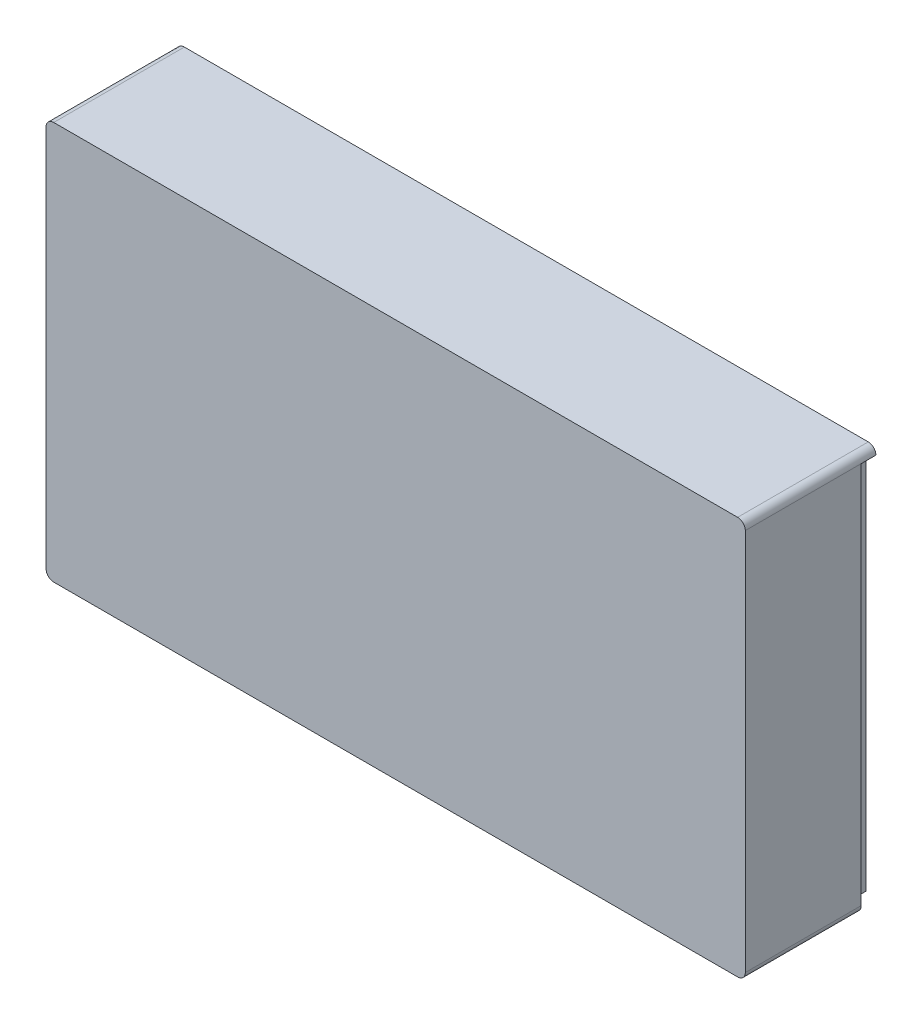
ISO-10303-21;
HEADER;
FILE_DESCRIPTION(('STEP AP214'),'2;1');
FILE_NAME('part.step','',(''),(''),'','','');
FILE_SCHEMA(('AUTOMOTIVE_DESIGN { 1 0 10303 214 1 1 1 1 }'));
ENDSEC;
DATA;
#1=APPLICATION_CONTEXT('core data for automotive mechanical design processes');
#2=APPLICATION_PROTOCOL_DEFINITION('international standard','automotive_design',2000,#1);
#3=PRODUCT_CONTEXT('',#1,'mechanical');
#4=PRODUCT('Part','Part','',(#3));
#5=PRODUCT_RELATED_PRODUCT_CATEGORY('part','',(#4));
#6=PRODUCT_DEFINITION_FORMATION('','',#4);
#7=PRODUCT_DEFINITION_CONTEXT('part definition',#1,'design');
#8=PRODUCT_DEFINITION('design','',#6,#7);
#9=PRODUCT_DEFINITION_SHAPE('','',#8);
#10=(LENGTH_UNIT() NAMED_UNIT(*) SI_UNIT(.MILLI.,.METRE.));
#11=(NAMED_UNIT(*) PLANE_ANGLE_UNIT() SI_UNIT($,.RADIAN.));
#12=(NAMED_UNIT(*) SI_UNIT($,.STERADIAN.) SOLID_ANGLE_UNIT());
#13=UNCERTAINTY_MEASURE_WITH_UNIT(LENGTH_MEASURE(1.E-05),#10,'distance_accuracy_value','');
#14=(GEOMETRIC_REPRESENTATION_CONTEXT(3) GLOBAL_UNCERTAINTY_ASSIGNED_CONTEXT((#13)) GLOBAL_UNIT_ASSIGNED_CONTEXT((#10,
#11,#12)) REPRESENTATION_CONTEXT('',''));
#15=CARTESIAN_POINT('',(0.,0.,0.));
#16=DIRECTION('',(0.,0.,1.));
#17=DIRECTION('',(1.,0.,0.));
#18=AXIS2_PLACEMENT_3D('',#15,#16,#17);
#19=CARTESIAN_POINT('',(0.,0.,0.));
#20=DIRECTION('',(0.,0.,1.));
#21=DIRECTION('',(1.,0.,0.));
#22=AXIS2_PLACEMENT_3D('',#19,#20,#21);
#23=PLANE('',#22);
#24=DIRECTION('',(1.,0.,0.));
#25=VECTOR('',#24,1.);
#26=CARTESIAN_POINT('',(145.,-79.3,0.));
#27=LINE('',#26,#25);
#28=CARTESIAN_POINT('',(-140.9,-79.3,0.));
#29=VERTEX_POINT('',#28);
#30=CARTESIAN_POINT('',(-133.825,-79.3,0.));
#31=VERTEX_POINT('',#30);
#32=EDGE_CURVE('E460',#29,#31,#27,.T.);
#33=ORIENTED_EDGE('',*,*,#32,.F.);
#34=DIRECTION('',(0.,-1.,0.));
#35=VECTOR('',#34,1.);
#36=CARTESIAN_POINT('',(-140.9,89.5150197238467,0.));
#37=LINE('',#36,#35);
#38=CARTESIAN_POINT('',(-140.9,79.375,0.));
#39=VERTEX_POINT('',#38);
#40=EDGE_CURVE('E411',#39,#29,#37,.T.);
#41=ORIENTED_EDGE('',*,*,#40,.F.);
#42=DIRECTION('',(1.,0.,0.));
#43=VECTOR('',#42,1.);
#44=CARTESIAN_POINT('',(-140.9,79.375,0.));
#45=LINE('',#44,#43);
#46=CARTESIAN_POINT('',(-145.,79.375,0.));
#47=VERTEX_POINT('',#46);
#48=EDGE_CURVE('E432',#47,#39,#45,.T.);
#49=ORIENTED_EDGE('',*,*,#48,.F.);
#50=CARTESIAN_POINT('',(-141.825,79.375,0.));
#51=DIRECTION('',(0.,0.,1.));
#52=DIRECTION('',(1.,0.,0.));
#53=AXIS2_PLACEMENT_3D('',#50,#51,#52);
#54=CIRCLE('',#53,3.175);
#55=CARTESIAN_POINT('',(-141.825,82.55,0.));
#56=VERTEX_POINT('',#55);
#57=EDGE_CURVE('E64',#47,#56,#54,.F.);
#58=ORIENTED_EDGE('',*,*,#57,.T.);
#59=DIRECTION('',(-1.,0.,0.));
#60=VECTOR('',#59,1.);
#61=CARTESIAN_POINT('',(-145.,82.55,0.));
#62=LINE('',#61,#60);
#63=CARTESIAN_POINT('',(141.825,82.55,0.));
#64=VERTEX_POINT('',#63);
#65=EDGE_CURVE('E294',#64,#56,#62,.T.);
#66=ORIENTED_EDGE('',*,*,#65,.F.);
#67=CARTESIAN_POINT('',(141.825,79.375,0.));
#68=DIRECTION('',(0.,0.,1.));
#69=DIRECTION('',(1.,0.,0.));
#70=AXIS2_PLACEMENT_3D('',#67,#68,#69);
#71=CIRCLE('',#70,3.175);
#72=CARTESIAN_POINT('',(145.,79.375,0.));
#73=VERTEX_POINT('',#72);
#74=EDGE_CURVE('E324',#64,#73,#71,.F.);
#75=ORIENTED_EDGE('',*,*,#74,.T.);
#76=DIRECTION('',(-1.,0.,0.));
#77=VECTOR('',#76,1.);
#78=CARTESIAN_POINT('',(140.9,79.375,0.));
#79=LINE('',#78,#77);
#80=CARTESIAN_POINT('',(140.9,79.375,0.));
#81=VERTEX_POINT('',#80);
#82=EDGE_CURVE('E259',#73,#81,#79,.T.);
#83=ORIENTED_EDGE('',*,*,#82,.T.);
#84=DIRECTION('',(0.,-1.,0.));
#85=VECTOR('',#84,1.);
#86=CARTESIAN_POINT('',(140.9,89.5150197238467,0.));
#87=LINE('',#86,#85);
#88=CARTESIAN_POINT('',(140.9,-79.3,0.));
#89=VERTEX_POINT('',#88);
#90=EDGE_CURVE('E370',#81,#89,#87,.T.);
#91=ORIENTED_EDGE('',*,*,#90,.T.);
#92=CARTESIAN_POINT('',(133.825,-79.3,0.));
#93=VERTEX_POINT('',#92);
#94=EDGE_CURVE('E240',#93,#89,#27,.T.);
#95=ORIENTED_EDGE('',*,*,#94,.F.);
#96=DIRECTION('',(0.,1.,0.));
#97=VECTOR('',#96,1.);
#98=CARTESIAN_POINT('',(133.825,79.375,0.));
#99=LINE('',#98,#97);
#100=CARTESIAN_POINT('',(133.825,79.375,0.));
#101=VERTEX_POINT('',#100);
#102=EDGE_CURVE('E280',#93,#101,#99,.T.);
#103=ORIENTED_EDGE('',*,*,#102,.T.);
#104=DIRECTION('',(-1.,0.,0.));
#105=VECTOR('',#104,1.);
#106=CARTESIAN_POINT('',(-133.825,79.375,0.));
#107=LINE('',#106,#105);
#108=CARTESIAN_POINT('',(-133.825,79.375,0.));
#109=VERTEX_POINT('',#108);
#110=EDGE_CURVE('E275',#101,#109,#107,.T.);
#111=ORIENTED_EDGE('',*,*,#110,.T.);
#112=DIRECTION('',(0.,-1.,0.));
#113=VECTOR('',#112,1.);
#114=CARTESIAN_POINT('',(-133.825,-79.375,0.));
#115=LINE('',#114,#113);
#116=EDGE_CURVE('E271',#109,#31,#115,.T.);
#117=ORIENTED_EDGE('',*,*,#116,.T.);
#118=EDGE_LOOP('',(#33,#41,#49,#58,#66,#75,#83,#91,#95,#103,#111,#117));
#119=FACE_BOUND('',#118,.T.);
#120=ADVANCED_FACE('F41',(#119),#23,.F.);
#121=CARTESIAN_POINT('',(140.9,89.5150197238467,2.9));
#122=DIRECTION('',(-1.,0.,0.));
#123=DIRECTION('',(0.,-1.,0.));
#124=AXIS2_PLACEMENT_3D('',#121,#122,#123);
#125=PLANE('',#124);
#126=DIRECTION('',(0.,0.,1.));
#127=VECTOR('',#126,1.);
#128=CARTESIAN_POINT('',(140.9,-79.3,2.9));
#129=LINE('',#128,#127);
#130=CARTESIAN_POINT('',(140.9,-79.3,2.9));
#131=VERTEX_POINT('',#130);
#132=EDGE_CURVE('E377',#89,#131,#129,.T.);
#133=ORIENTED_EDGE('',*,*,#132,.F.);
#134=ORIENTED_EDGE('',*,*,#90,.F.);
#135=DIRECTION('',(0.,0.,1.));
#136=VECTOR('',#135,1.);
#137=CARTESIAN_POINT('',(140.9,79.375,2.9));
#138=LINE('',#137,#136);
#139=CARTESIAN_POINT('',(140.9,79.375,2.9));
#140=VERTEX_POINT('',#139);
#141=EDGE_CURVE('E343',#81,#140,#138,.T.);
#142=ORIENTED_EDGE('',*,*,#141,.T.);
#143=DIRECTION('',(0.,-1.,0.));
#144=VECTOR('',#143,1.);
#145=CARTESIAN_POINT('',(140.9,89.5150197238467,2.9));
#146=LINE('',#145,#144);
#147=EDGE_CURVE('E249',#140,#131,#146,.T.);
#148=ORIENTED_EDGE('',*,*,#147,.T.);
#149=EDGE_LOOP('',(#133,#134,#142,#148));
#150=FACE_BOUND('',#149,.T.);
#151=ADVANCED_FACE('F376',(#150),#125,.F.);
#152=CARTESIAN_POINT('',(140.9,89.5150197238467,2.9));
#153=DIRECTION('',(0.,0.,-1.));
#154=DIRECTION('',(-1.,0.,0.));
#155=AXIS2_PLACEMENT_3D('',#152,#153,#154);
#156=PLANE('',#155);
#157=DIRECTION('',(-1.,0.,0.));
#158=VECTOR('',#157,1.);
#159=CARTESIAN_POINT('',(140.9,-79.3,2.9));
#160=LINE('',#159,#158);
#161=CARTESIAN_POINT('',(136.9,-79.3,2.90000000000003));
#162=VERTEX_POINT('',#161);
#163=EDGE_CURVE('E227',#131,#162,#160,.T.);
#164=ORIENTED_EDGE('',*,*,#163,.F.);
#165=ORIENTED_EDGE('',*,*,#147,.F.);
#166=DIRECTION('',(-1.,0.,0.));
#167=VECTOR('',#166,1.);
#168=CARTESIAN_POINT('',(140.9,79.375,2.9));
#169=LINE('',#168,#167);
#170=CARTESIAN_POINT('',(136.9,79.375,2.90000000000003));
#171=VERTEX_POINT('',#170);
#172=EDGE_CURVE('E380',#140,#171,#169,.T.);
#173=ORIENTED_EDGE('',*,*,#172,.T.);
#174=DIRECTION('',(0.,-1.,0.));
#175=VECTOR('',#174,1.);
#176=CARTESIAN_POINT('',(136.9,89.5150197238467,2.90000000000003));
#177=LINE('',#176,#175);
#178=EDGE_CURVE('E246',#171,#162,#177,.T.);
#179=ORIENTED_EDGE('',*,*,#178,.T.);
#180=EDGE_LOOP('',(#164,#165,#173,#179));
#181=FACE_BOUND('',#180,.T.);
#182=ADVANCED_FACE('F379',(#181),#156,.F.);
#183=CARTESIAN_POINT('',(136.9,89.5150197238467,2.90000000000003));
#184=DIRECTION('',(-1.,0.,0.));
#185=DIRECTION('',(0.,-1.,0.));
#186=AXIS2_PLACEMENT_3D('',#183,#184,#185);
#187=PLANE('',#186);
#188=DIRECTION('',(0.,0.,1.));
#189=VECTOR('',#188,1.);
#190=CARTESIAN_POINT('',(136.9,-79.3,2.90000000000003));
#191=LINE('',#190,#189);
#192=CARTESIAN_POINT('',(136.9,-79.3,6.1));
#193=VERTEX_POINT('',#192);
#194=EDGE_CURVE('E221',#162,#193,#191,.T.);
#195=ORIENTED_EDGE('',*,*,#194,.F.);
#196=ORIENTED_EDGE('',*,*,#178,.F.);
#197=DIRECTION('',(0.,0.,1.));
#198=VECTOR('',#197,1.);
#199=CARTESIAN_POINT('',(136.9,79.375,2.90000000000003));
#200=LINE('',#199,#198);
#201=CARTESIAN_POINT('',(136.9,79.375,6.1));
#202=VERTEX_POINT('',#201);
#203=EDGE_CURVE('E244',#171,#202,#200,.T.);
#204=ORIENTED_EDGE('',*,*,#203,.T.);
#205=DIRECTION('',(0.,-1.,0.));
#206=VECTOR('',#205,1.);
#207=CARTESIAN_POINT('',(136.9,89.5150197238467,6.1));
#208=LINE('',#207,#206);
#209=EDGE_CURVE('E237',#202,#193,#208,.T.);
#210=ORIENTED_EDGE('',*,*,#209,.T.);
#211=EDGE_LOOP('',(#195,#196,#204,#210));
#212=FACE_BOUND('',#211,.T.);
#213=ADVANCED_FACE('F242',(#212),#187,.F.);
#214=CARTESIAN_POINT('',(-140.9,89.5150197238467,2.9));
#215=DIRECTION('',(-1.,0.,0.));
#216=DIRECTION('',(0.,-1.,0.));
#217=AXIS2_PLACEMENT_3D('',#214,#215,#216);
#218=PLANE('',#217);
#219=ORIENTED_EDGE('',*,*,#40,.T.);
#220=DIRECTION('',(0.,0.,1.));
#221=VECTOR('',#220,1.);
#222=CARTESIAN_POINT('',(-140.9,-79.3,2.9));
#223=LINE('',#222,#221);
#224=CARTESIAN_POINT('',(-140.9,-79.3,2.9));
#225=VERTEX_POINT('',#224);
#226=EDGE_CURVE('E232',#29,#225,#223,.T.);
#227=ORIENTED_EDGE('',*,*,#226,.T.);
#228=DIRECTION('',(0.,-1.,0.));
#229=VECTOR('',#228,1.);
#230=CARTESIAN_POINT('',(-140.9,89.5150197238467,2.9));
#231=LINE('',#230,#229);
#232=CARTESIAN_POINT('',(-140.9,79.375,2.9));
#233=VERTEX_POINT('',#232);
#234=EDGE_CURVE('E448',#233,#225,#231,.T.);
#235=ORIENTED_EDGE('',*,*,#234,.F.);
#236=DIRECTION('',(0.,0.,1.));
#237=VECTOR('',#236,1.);
#238=CARTESIAN_POINT('',(-140.9,79.375,2.9));
#239=LINE('',#238,#237);
#240=EDGE_CURVE('E428',#39,#233,#239,.T.);
#241=ORIENTED_EDGE('',*,*,#240,.F.);
#242=EDGE_LOOP('',(#219,#227,#235,#241));
#243=FACE_BOUND('',#242,.T.);
#244=ADVANCED_FACE('F463',(#243),#218,.T.);
#245=CARTESIAN_POINT('',(-140.9,89.5150197238467,2.9));
#246=DIRECTION('',(0.,0.,1.));
#247=DIRECTION('',(1.,0.,0.));
#248=AXIS2_PLACEMENT_3D('',#245,#246,#247);
#249=PLANE('',#248);
#250=ORIENTED_EDGE('',*,*,#234,.T.);
#251=DIRECTION('',(1.,0.,0.));
#252=VECTOR('',#251,1.);
#253=CARTESIAN_POINT('',(-140.9,-79.3,2.9));
#254=LINE('',#253,#252);
#255=CARTESIAN_POINT('',(-136.9,-79.3,2.90000000000003));
#256=VERTEX_POINT('',#255);
#257=EDGE_CURVE('E469',#225,#256,#254,.T.);
#258=ORIENTED_EDGE('',*,*,#257,.T.);
#259=DIRECTION('',(0.,-1.,0.));
#260=VECTOR('',#259,1.);
#261=CARTESIAN_POINT('',(-136.9,89.5150197238467,2.90000000000003));
#262=LINE('',#261,#260);
#263=CARTESIAN_POINT('',(-136.9,79.375,2.90000000000003));
#264=VERTEX_POINT('',#263);
#265=EDGE_CURVE('E445',#264,#256,#262,.T.);
#266=ORIENTED_EDGE('',*,*,#265,.F.);
#267=DIRECTION('',(1.,0.,0.));
#268=VECTOR('',#267,1.);
#269=CARTESIAN_POINT('',(-140.9,79.375,2.9));
#270=LINE('',#269,#268);
#271=EDGE_CURVE('E431',#233,#264,#270,.T.);
#272=ORIENTED_EDGE('',*,*,#271,.F.);
#273=EDGE_LOOP('',(#250,#258,#266,#272));
#274=FACE_BOUND('',#273,.T.);
#275=ADVANCED_FACE('F467',(#274),#249,.T.);
#276=CARTESIAN_POINT('',(-136.9,89.5150197238467,2.90000000000003));
#277=DIRECTION('',(-1.,0.,0.));
#278=DIRECTION('',(0.,-1.,0.));
#279=AXIS2_PLACEMENT_3D('',#276,#277,#278);
#280=PLANE('',#279);
#281=ORIENTED_EDGE('',*,*,#265,.T.);
#282=DIRECTION('',(0.,0.,1.));
#283=VECTOR('',#282,1.);
#284=CARTESIAN_POINT('',(-136.9,-79.3,2.90000000000003));
#285=LINE('',#284,#283);
#286=CARTESIAN_POINT('',(-136.9,-79.3,6.1));
#287=VERTEX_POINT('',#286);
#288=EDGE_CURVE('E473',#256,#287,#285,.T.);
#289=ORIENTED_EDGE('',*,*,#288,.T.);
#290=DIRECTION('',(0.,-1.,0.));
#291=VECTOR('',#290,1.);
#292=CARTESIAN_POINT('',(-136.9,89.5150197238467,6.1));
#293=LINE('',#292,#291);
#294=CARTESIAN_POINT('',(-136.9,79.375,6.1));
#295=VERTEX_POINT('',#294);
#296=EDGE_CURVE('E442',#295,#287,#293,.T.);
#297=ORIENTED_EDGE('',*,*,#296,.F.);
#298=DIRECTION('',(0.,0.,1.));
#299=VECTOR('',#298,1.);
#300=CARTESIAN_POINT('',(-136.9,79.375,2.90000000000003));
#301=LINE('',#300,#299);
#302=EDGE_CURVE('E435',#264,#295,#301,.T.);
#303=ORIENTED_EDGE('',*,*,#302,.F.);
#304=EDGE_LOOP('',(#281,#289,#297,#303));
#305=FACE_BOUND('',#304,.T.);
#306=ADVANCED_FACE('F472',(#305),#280,.T.);
#307=CARTESIAN_POINT('',(133.825,79.375,51.));
#308=DIRECTION('',(-1.,0.,0.));
#309=DIRECTION('',(0.,0.,1.));
#310=AXIS2_PLACEMENT_3D('',#307,#308,#309);
#311=PLANE('',#310);
#312=DIRECTION('',(0.,1.,0.));
#313=VECTOR('',#312,1.);
#314=CARTESIAN_POINT('',(133.825,79.375,6.1));
#315=LINE('',#314,#313);
#316=CARTESIAN_POINT('',(133.825,-79.375,6.1));
#317=VERTEX_POINT('',#316);
#318=CARTESIAN_POINT('',(133.825,-79.3,6.1));
#319=VERTEX_POINT('',#318);
#320=EDGE_CURVE('E239',#317,#319,#315,.T.);
#321=ORIENTED_EDGE('',*,*,#320,.F.);
#322=DIRECTION('',(0.,0.,-1.));
#323=VECTOR('',#322,1.);
#324=CARTESIAN_POINT('',(133.825,-79.375,51.));
#325=LINE('',#324,#323);
#326=CARTESIAN_POINT('',(133.825,-79.375,9.275));
#327=VERTEX_POINT('',#326);
#328=EDGE_CURVE('E288',#327,#317,#325,.T.);
#329=ORIENTED_EDGE('',*,*,#328,.F.);
#330=DIRECTION('',(0.,1.,0.));
#331=VECTOR('',#330,1.);
#332=CARTESIAN_POINT('',(133.825,-121.712409580653,9.275));
#333=LINE('',#332,#331);
#334=CARTESIAN_POINT('',(133.825,79.375,9.275));
#335=VERTEX_POINT('',#334);
#336=EDGE_CURVE('E422',#327,#335,#333,.T.);
#337=ORIENTED_EDGE('',*,*,#336,.T.);
#338=DIRECTION('',(0.,0.,-1.));
#339=VECTOR('',#338,1.);
#340=CARTESIAN_POINT('',(133.825,79.375,51.));
#341=LINE('',#340,#339);
#342=EDGE_CURVE('E285',#335,#101,#341,.T.);
#343=ORIENTED_EDGE('',*,*,#342,.T.);
#344=ORIENTED_EDGE('',*,*,#102,.F.);
#345=DIRECTION('',(0.,0.,1.));
#346=VECTOR('',#345,1.);
#347=CARTESIAN_POINT('',(133.825,-79.3,51.));
#348=LINE('',#347,#346);
#349=EDGE_CURVE('E388',#93,#319,#348,.T.);
#350=ORIENTED_EDGE('',*,*,#349,.T.);
#351=EDGE_LOOP('',(#321,#329,#337,#343,#344,#350));
#352=FACE_BOUND('',#351,.T.);
#353=ADVANCED_FACE('F513',(#352),#311,.T.);
#354=CARTESIAN_POINT('',(-145.,82.55,51.));
#355=DIRECTION('',(1.,0.,0.));
#356=DIRECTION('',(0.,0.,-1.));
#357=AXIS2_PLACEMENT_3D('',#354,#355,#356);
#358=PLANE('',#357);
#359=DIRECTION('',(0.,-1.,0.));
#360=VECTOR('',#359,1.);
#361=CARTESIAN_POINT('',(-145.,89.5150197238467,6.1));
#362=LINE('',#361,#360);
#363=CARTESIAN_POINT('',(-145.,79.375,6.1));
#364=VERTEX_POINT('',#363);
#365=CARTESIAN_POINT('',(-145.,-79.375,6.1));
#366=VERTEX_POINT('',#365);
#367=EDGE_CURVE('E440',#364,#366,#362,.T.);
#368=ORIENTED_EDGE('',*,*,#367,.T.);
#369=DIRECTION('',(0.,0.,-1.));
#370=VECTOR('',#369,1.);
#371=CARTESIAN_POINT('',(-145.,-79.375,51.));
#372=LINE('',#371,#370);
#373=CARTESIAN_POINT('',(-145.,-79.375,54.175));
#374=VERTEX_POINT('',#373);
#375=EDGE_CURVE('E322',#366,#374,#372,.F.);
#376=ORIENTED_EDGE('',*,*,#375,.T.);
#377=DIRECTION('',(0.,-1.,0.));
#378=VECTOR('',#377,1.);
#379=CARTESIAN_POINT('',(-145.,82.55,54.175));
#380=LINE('',#379,#378);
#381=CARTESIAN_POINT('',(-145.,79.375,54.175));
#382=VERTEX_POINT('',#381);
#383=EDGE_CURVE('E258',#382,#374,#380,.T.);
#384=ORIENTED_EDGE('',*,*,#383,.F.);
#385=DIRECTION('',(0.,0.,-1.));
#386=VECTOR('',#385,1.);
#387=CARTESIAN_POINT('',(-145.,79.375,51.));
#388=LINE('',#387,#386);
#389=EDGE_CURVE('E319',#382,#364,#388,.T.);
#390=ORIENTED_EDGE('',*,*,#389,.T.);
#391=EDGE_LOOP('',(#368,#376,#384,#390));
#392=FACE_BOUND('',#391,.T.);
#393=ADVANCED_FACE('F478',(#392),#358,.F.);
#394=CARTESIAN_POINT('',(-145.,-82.55,51.));
#395=DIRECTION('',(0.,1.,0.));
#396=DIRECTION('',(-1.,0.,0.));
#397=AXIS2_PLACEMENT_3D('',#394,#395,#396);
#398=PLANE('',#397);
#399=DIRECTION('',(0.,0.,-1.));
#400=VECTOR('',#399,1.);
#401=CARTESIAN_POINT('',(-141.825,-82.55,51.));
#402=LINE('',#401,#400);
#403=CARTESIAN_POINT('',(-141.825,-82.55,54.175));
#404=VERTEX_POINT('',#403);
#405=CARTESIAN_POINT('',(-141.825,-82.55,6.1));
#406=VERTEX_POINT('',#405);
#407=EDGE_CURVE('E303',#404,#406,#402,.T.);
#408=ORIENTED_EDGE('',*,*,#407,.T.);
#409=DIRECTION('',(-1.,0.,0.));
#410=VECTOR('',#409,1.);
#411=CARTESIAN_POINT('',(145.,-82.55,6.1));
#412=LINE('',#411,#410);
#413=CARTESIAN_POINT('',(141.825,-82.55,6.1));
#414=VERTEX_POINT('',#413);
#415=EDGE_CURVE('E251',#414,#406,#412,.T.);
#416=ORIENTED_EDGE('',*,*,#415,.F.);
#417=DIRECTION('',(0.,0.,-1.));
#418=VECTOR('',#417,1.);
#419=CARTESIAN_POINT('',(141.825,-82.55,51.));
#420=LINE('',#419,#418);
#421=CARTESIAN_POINT('',(141.825,-82.55,54.175));
#422=VERTEX_POINT('',#421);
#423=EDGE_CURVE('E306',#414,#422,#420,.F.);
#424=ORIENTED_EDGE('',*,*,#423,.T.);
#425=DIRECTION('',(1.,0.,0.));
#426=VECTOR('',#425,1.);
#427=CARTESIAN_POINT('',(-145.,-82.55,54.175));
#428=LINE('',#427,#426);
#429=EDGE_CURVE('E262',#404,#422,#428,.T.);
#430=ORIENTED_EDGE('',*,*,#429,.F.);
#431=EDGE_LOOP('',(#408,#416,#424,#430));
#432=FACE_BOUND('',#431,.T.);
#433=ADVANCED_FACE('F362',(#432),#398,.F.);
#434=CARTESIAN_POINT('',(145.,82.55,51.));
#435=DIRECTION('',(-1.,0.,0.));
#436=DIRECTION('',(0.,0.,1.));
#437=AXIS2_PLACEMENT_3D('',#434,#435,#436);
#438=PLANE('',#437);
#439=DIRECTION('',(0.,1.,0.));
#440=VECTOR('',#439,1.);
#441=CARTESIAN_POINT('',(145.,82.55,54.175));
#442=LINE('',#441,#440);
#443=CARTESIAN_POINT('',(145.,-79.375,54.175));
#444=VERTEX_POINT('',#443);
#445=CARTESIAN_POINT('',(145.,79.375,54.175));
#446=VERTEX_POINT('',#445);
#447=EDGE_CURVE('E265',#444,#446,#442,.T.);
#448=ORIENTED_EDGE('',*,*,#447,.F.);
#449=DIRECTION('',(0.,0.,-1.));
#450=VECTOR('',#449,1.);
#451=CARTESIAN_POINT('',(145.,-79.375,51.));
#452=LINE('',#451,#450);
#453=CARTESIAN_POINT('',(145.,-79.375,6.1));
#454=VERTEX_POINT('',#453);
#455=EDGE_CURVE('E298',#444,#454,#452,.T.);
#456=ORIENTED_EDGE('',*,*,#455,.T.);
#457=DIRECTION('',(0.,-1.,0.));
#458=VECTOR('',#457,1.);
#459=CARTESIAN_POINT('',(145.,89.5150197238467,6.1));
#460=LINE('',#459,#458);
#461=CARTESIAN_POINT('',(145.,79.375,6.1));
#462=VERTEX_POINT('',#461);
#463=EDGE_CURVE('E247',#462,#454,#460,.T.);
#464=ORIENTED_EDGE('',*,*,#463,.F.);
#465=DIRECTION('',(0.,0.,-1.));
#466=VECTOR('',#465,1.);
#467=CARTESIAN_POINT('',(145.,79.375,51.));
#468=LINE('',#467,#466);
#469=EDGE_CURVE('E296',#462,#446,#468,.F.);
#470=ORIENTED_EDGE('',*,*,#469,.T.);
#471=EDGE_LOOP('',(#448,#456,#464,#470));
#472=FACE_BOUND('',#471,.T.);
#473=ADVANCED_FACE('F349',(#472),#438,.F.);
#474=CARTESIAN_POINT('',(-145.,82.55,51.));
#475=DIRECTION('',(0.,-1.,0.));
#476=DIRECTION('',(0.,0.,-1.));
#477=AXIS2_PLACEMENT_3D('',#474,#475,#476);
#478=PLANE('',#477);
#479=ORIENTED_EDGE('',*,*,#65,.T.);
#480=DIRECTION('',(0.,0.,-1.));
#481=VECTOR('',#480,1.);
#482=CARTESIAN_POINT('',(-141.825,82.55,51.));
#483=LINE('',#482,#481);
#484=CARTESIAN_POINT('',(-141.825,82.55,54.175));
#485=VERTEX_POINT('',#484);
#486=EDGE_CURVE('E11',#56,#485,#483,.F.);
#487=ORIENTED_EDGE('',*,*,#486,.T.);
#488=DIRECTION('',(-1.,0.,0.));
#489=VECTOR('',#488,1.);
#490=CARTESIAN_POINT('',(-145.,82.55,54.175));
#491=LINE('',#490,#489);
#492=CARTESIAN_POINT('',(141.825,82.55,54.175));
#493=VERTEX_POINT('',#492);
#494=EDGE_CURVE('E268',#493,#485,#491,.T.);
#495=ORIENTED_EDGE('',*,*,#494,.F.);
#496=DIRECTION('',(0.,0.,-1.));
#497=VECTOR('',#496,1.);
#498=CARTESIAN_POINT('',(141.825,82.55,51.));
#499=LINE('',#498,#497);
#500=EDGE_CURVE('E49',#493,#64,#499,.T.);
#501=ORIENTED_EDGE('',*,*,#500,.T.);
#502=EDGE_LOOP('',(#479,#487,#495,#501));
#503=FACE_BOUND('',#502,.T.);
#504=ADVANCED_FACE('F330',(#503),#478,.F.);
#505=CARTESIAN_POINT('',(-133.825,-79.375,51.));
#506=DIRECTION('',(1.,0.,0.));
#507=DIRECTION('',(0.,1.,0.));
#508=AXIS2_PLACEMENT_3D('',#505,#506,#507);
#509=PLANE('',#508);
#510=DIRECTION('',(0.,-1.,0.));
#511=VECTOR('',#510,1.);
#512=CARTESIAN_POINT('',(-133.825,-79.375,6.09999999999997));
#513=LINE('',#512,#511);
#514=CARTESIAN_POINT('',(-133.825,-79.3,6.09999999999997));
#515=VERTEX_POINT('',#514);
#516=CARTESIAN_POINT('',(-133.825,-79.375,6.09999999999997));
#517=VERTEX_POINT('',#516);
#518=EDGE_CURVE('E542',#515,#517,#513,.T.);
#519=ORIENTED_EDGE('',*,*,#518,.F.);
#520=DIRECTION('',(0.,0.,-1.));
#521=VECTOR('',#520,1.);
#522=CARTESIAN_POINT('',(-133.825,-79.3,51.));
#523=LINE('',#522,#521);
#524=EDGE_CURVE('E382',#515,#31,#523,.T.);
#525=ORIENTED_EDGE('',*,*,#524,.T.);
#526=ORIENTED_EDGE('',*,*,#116,.F.);
#527=DIRECTION('',(0.,0.,-1.));
#528=VECTOR('',#527,1.);
#529=CARTESIAN_POINT('',(-133.825,79.375,51.));
#530=LINE('',#529,#528);
#531=CARTESIAN_POINT('',(-133.825,79.375,9.275));
#532=VERTEX_POINT('',#531);
#533=EDGE_CURVE('E277',#532,#109,#530,.T.);
#534=ORIENTED_EDGE('',*,*,#533,.F.);
#535=DIRECTION('',(0.,1.,0.));
#536=VECTOR('',#535,1.);
#537=CARTESIAN_POINT('',(-133.825,-121.712409580653,9.275));
#538=LINE('',#537,#536);
#539=CARTESIAN_POINT('',(-133.825,-79.375,9.275));
#540=VERTEX_POINT('',#539);
#541=EDGE_CURVE('E404',#540,#532,#538,.T.);
#542=ORIENTED_EDGE('',*,*,#541,.F.);
#543=DIRECTION('',(0.,0.,-1.));
#544=VECTOR('',#543,1.);
#545=CARTESIAN_POINT('',(-133.825,-79.375,51.));
#546=LINE('',#545,#544);
#547=EDGE_CURVE('E291',#540,#517,#546,.T.);
#548=ORIENTED_EDGE('',*,*,#547,.T.);
#549=EDGE_LOOP('',(#519,#525,#526,#534,#542,#548));
#550=FACE_BOUND('',#549,.T.);
#551=ADVANCED_FACE('F504',(#550),#509,.T.);
#552=CARTESIAN_POINT('',(133.825,-79.375,51.));
#553=DIRECTION('',(0.,1.,0.));
#554=DIRECTION('',(0.,0.,1.));
#555=AXIS2_PLACEMENT_3D('',#552,#553,#554);
#556=PLANE('',#555);
#557=DIRECTION('',(1.,0.,0.));
#558=VECTOR('',#557,1.);
#559=CARTESIAN_POINT('',(133.825,-79.375,6.1));
#560=LINE('',#559,#558);
#561=EDGE_CURVE('E539',#517,#317,#560,.T.);
#562=ORIENTED_EDGE('',*,*,#561,.F.);
#563=ORIENTED_EDGE('',*,*,#547,.F.);
#564=DIRECTION('',(1.,0.,0.));
#565=VECTOR('',#564,1.);
#566=CARTESIAN_POINT('',(0.,-79.375,9.275));
#567=LINE('',#566,#565);
#568=CARTESIAN_POINT('',(-141.,-79.375,9.275));
#569=VERTEX_POINT('',#568);
#570=EDGE_CURVE('E391',#569,#540,#567,.T.);
#571=ORIENTED_EDGE('',*,*,#570,.F.);
#572=DIRECTION('',(0.,0.,-1.));
#573=VECTOR('',#572,1.);
#574=CARTESIAN_POINT('',(-141.,-79.375,0.));
#575=LINE('',#574,#573);
#576=CARTESIAN_POINT('',(-141.,-79.375,51.));
#577=VERTEX_POINT('',#576);
#578=EDGE_CURVE('E393',#577,#569,#575,.T.);
#579=ORIENTED_EDGE('',*,*,#578,.F.);
#580=DIRECTION('',(1.,0.,0.));
#581=VECTOR('',#580,1.);
#582=CARTESIAN_POINT('',(133.825,-79.375,51.));
#583=LINE('',#582,#581);
#584=CARTESIAN_POINT('',(141.,-79.375,51.));
#585=VERTEX_POINT('',#584);
#586=EDGE_CURVE('E272',#577,#585,#583,.T.);
#587=ORIENTED_EDGE('',*,*,#586,.T.);
#588=DIRECTION('',(0.,0.,-1.));
#589=VECTOR('',#588,1.);
#590=CARTESIAN_POINT('',(141.,-79.375,0.));
#591=LINE('',#590,#589);
#592=CARTESIAN_POINT('',(141.,-79.375,9.275));
#593=VERTEX_POINT('',#592);
#594=EDGE_CURVE('E408',#585,#593,#591,.T.);
#595=ORIENTED_EDGE('',*,*,#594,.T.);
#596=DIRECTION('',(-1.,0.,0.));
#597=VECTOR('',#596,1.);
#598=CARTESIAN_POINT('',(0.,-79.375,9.275));
#599=LINE('',#598,#597);
#600=EDGE_CURVE('E412',#593,#327,#599,.T.);
#601=ORIENTED_EDGE('',*,*,#600,.T.);
#602=ORIENTED_EDGE('',*,*,#328,.T.);
#603=EDGE_LOOP('',(#562,#563,#571,#579,#587,#595,#601,#602));
#604=FACE_BOUND('',#603,.T.);
#605=ADVANCED_FACE('F526',(#604),#556,.T.);
#606=CARTESIAN_POINT('',(-133.825,79.375,51.));
#607=DIRECTION('',(0.,-1.,0.));
#608=DIRECTION('',(0.,0.,-1.));
#609=AXIS2_PLACEMENT_3D('',#606,#607,#608);
#610=PLANE('',#609);
#611=ORIENTED_EDGE('',*,*,#110,.F.);
#612=ORIENTED_EDGE('',*,*,#342,.F.);
#613=DIRECTION('',(1.,0.,0.));
#614=VECTOR('',#613,1.);
#615=CARTESIAN_POINT('',(0.,79.375,9.275));
#616=LINE('',#615,#614);
#617=CARTESIAN_POINT('',(141.,79.375,9.275));
#618=VERTEX_POINT('',#617);
#619=EDGE_CURVE('E415',#335,#618,#616,.T.);
#620=ORIENTED_EDGE('',*,*,#619,.T.);
#621=DIRECTION('',(0.,0.,1.));
#622=VECTOR('',#621,1.);
#623=CARTESIAN_POINT('',(141.,79.375,0.));
#624=LINE('',#623,#622);
#625=CARTESIAN_POINT('',(141.,79.375,51.));
#626=VERTEX_POINT('',#625);
#627=EDGE_CURVE('E396',#618,#626,#624,.T.);
#628=ORIENTED_EDGE('',*,*,#627,.T.);
#629=DIRECTION('',(-1.,0.,0.));
#630=VECTOR('',#629,1.);
#631=CARTESIAN_POINT('',(-133.825,79.375,51.));
#632=LINE('',#631,#630);
#633=CARTESIAN_POINT('',(-141.,79.375,51.));
#634=VERTEX_POINT('',#633);
#635=EDGE_CURVE('E274',#626,#634,#632,.T.);
#636=ORIENTED_EDGE('',*,*,#635,.T.);
#637=DIRECTION('',(0.,0.,1.));
#638=VECTOR('',#637,1.);
#639=CARTESIAN_POINT('',(-141.,79.375,0.));
#640=LINE('',#639,#638);
#641=CARTESIAN_POINT('',(-141.,79.375,9.275));
#642=VERTEX_POINT('',#641);
#643=EDGE_CURVE('E390',#642,#634,#640,.T.);
#644=ORIENTED_EDGE('',*,*,#643,.F.);
#645=DIRECTION('',(-1.,0.,0.));
#646=VECTOR('',#645,1.);
#647=CARTESIAN_POINT('',(0.,79.375,9.275));
#648=LINE('',#647,#646);
#649=EDGE_CURVE('E399',#532,#642,#648,.T.);
#650=ORIENTED_EDGE('',*,*,#649,.F.);
#651=ORIENTED_EDGE('',*,*,#533,.T.);
#652=EDGE_LOOP('',(#611,#612,#620,#628,#636,#644,#650,#651));
#653=FACE_BOUND('',#652,.T.);
#654=ADVANCED_FACE('F524',(#653),#610,.T.);
#655=CARTESIAN_POINT('',(0.,0.,51.));
#656=DIRECTION('',(0.,0.,1.));
#657=DIRECTION('',(1.,0.,0.));
#658=AXIS2_PLACEMENT_3D('',#655,#656,#657);
#659=PLANE('',#658);
#660=ORIENTED_EDGE('',*,*,#586,.F.);
#661=DIRECTION('',(0.,1.,0.));
#662=VECTOR('',#661,1.);
#663=CARTESIAN_POINT('',(-141.,-121.712409580653,51.));
#664=LINE('',#663,#662);
#665=EDGE_CURVE('E402',#577,#634,#664,.T.);
#666=ORIENTED_EDGE('',*,*,#665,.T.);
#667=ORIENTED_EDGE('',*,*,#635,.F.);
#668=DIRECTION('',(0.,1.,0.));
#669=VECTOR('',#668,1.);
#670=CARTESIAN_POINT('',(141.,-121.712409580653,51.));
#671=LINE('',#670,#669);
#672=EDGE_CURVE('E419',#585,#626,#671,.T.);
#673=ORIENTED_EDGE('',*,*,#672,.F.);
#674=EDGE_LOOP('',(#660,#666,#667,#673));
#675=FACE_BOUND('',#674,.T.);
#676=ADVANCED_FACE('F534',(#675),#659,.F.);
#677=CARTESIAN_POINT('',(0.,0.,54.175));
#678=DIRECTION('',(0.,0.,1.));
#679=DIRECTION('',(1.,0.,0.));
#680=AXIS2_PLACEMENT_3D('',#677,#678,#679);
#681=PLANE('',#680);
#682=ORIENTED_EDGE('',*,*,#429,.T.);
#683=CARTESIAN_POINT('',(141.825,-79.375,54.175));
#684=DIRECTION('',(0.,0.,1.));
#685=DIRECTION('',(1.,0.,0.));
#686=AXIS2_PLACEMENT_3D('',#683,#684,#685);
#687=CIRCLE('',#686,3.175);
#688=EDGE_CURVE('E314',#422,#444,#687,.T.);
#689=ORIENTED_EDGE('',*,*,#688,.T.);
#690=ORIENTED_EDGE('',*,*,#447,.T.);
#691=CARTESIAN_POINT('',(141.825,79.375,54.175));
#692=DIRECTION('',(0.,0.,1.));
#693=DIRECTION('',(1.,0.,0.));
#694=AXIS2_PLACEMENT_3D('',#691,#692,#693);
#695=CIRCLE('',#694,3.175);
#696=EDGE_CURVE('E308',#446,#493,#695,.T.);
#697=ORIENTED_EDGE('',*,*,#696,.T.);
#698=ORIENTED_EDGE('',*,*,#494,.T.);
#699=CARTESIAN_POINT('',(-141.825,79.375,54.175));
#700=DIRECTION('',(0.,0.,1.));
#701=DIRECTION('',(1.,0.,0.));
#702=AXIS2_PLACEMENT_3D('',#699,#700,#701);
#703=CIRCLE('',#702,3.175);
#704=EDGE_CURVE('E310',#485,#382,#703,.T.);
#705=ORIENTED_EDGE('',*,*,#704,.T.);
#706=ORIENTED_EDGE('',*,*,#383,.T.);
#707=CARTESIAN_POINT('',(-141.825,-79.375,54.175));
#708=DIRECTION('',(0.,0.,1.));
#709=DIRECTION('',(1.,0.,0.));
#710=AXIS2_PLACEMENT_3D('',#707,#708,#709);
#711=CIRCLE('',#710,3.175);
#712=EDGE_CURVE('E312',#374,#404,#711,.T.);
#713=ORIENTED_EDGE('',*,*,#712,.T.);
#714=EDGE_LOOP('',(#682,#689,#690,#697,#698,#705,#706,#713));
#715=FACE_BOUND('',#714,.T.);
#716=ADVANCED_FACE('F352',(#715),#681,.T.);
#717=CARTESIAN_POINT('',(145.,89.5150197238467,6.1));
#718=DIRECTION('',(0.,0.,1.));
#719=DIRECTION('',(1.,0.,0.));
#720=AXIS2_PLACEMENT_3D('',#717,#718,#719);
#721=PLANE('',#720);
#722=ORIENTED_EDGE('',*,*,#415,.T.);
#723=CARTESIAN_POINT('',(-141.825,-79.375,6.1));
#724=DIRECTION('',(0.,0.,-1.));
#725=DIRECTION('',(-1.,0.,0.));
#726=AXIS2_PLACEMENT_3D('',#723,#724,#725);
#727=CIRCLE('',#726,3.175);
#728=EDGE_CURVE('E316',#406,#366,#727,.T.);
#729=ORIENTED_EDGE('',*,*,#728,.T.);
#730=ORIENTED_EDGE('',*,*,#367,.F.);
#731=DIRECTION('',(-1.,0.,0.));
#732=VECTOR('',#731,1.);
#733=CARTESIAN_POINT('',(-145.,79.375,6.1));
#734=LINE('',#733,#732);
#735=EDGE_CURVE('E366',#295,#364,#734,.T.);
#736=ORIENTED_EDGE('',*,*,#735,.F.);
#737=ORIENTED_EDGE('',*,*,#296,.T.);
#738=DIRECTION('',(-1.,0.,0.));
#739=VECTOR('',#738,1.);
#740=CARTESIAN_POINT('',(145.,-79.3,6.1));
#741=LINE('',#740,#739);
#742=EDGE_CURVE('E56',#515,#287,#741,.T.);
#743=ORIENTED_EDGE('',*,*,#742,.F.);
#744=ORIENTED_EDGE('',*,*,#518,.T.);
#745=ORIENTED_EDGE('',*,*,#561,.T.);
#746=ORIENTED_EDGE('',*,*,#320,.T.);
#747=EDGE_CURVE('E224',#193,#319,#741,.T.);
#748=ORIENTED_EDGE('',*,*,#747,.F.);
#749=ORIENTED_EDGE('',*,*,#209,.F.);
#750=DIRECTION('',(1.,0.,0.));
#751=VECTOR('',#750,1.);
#752=CARTESIAN_POINT('',(145.,79.375,6.1));
#753=LINE('',#752,#751);
#754=EDGE_CURVE('E371',#202,#462,#753,.T.);
#755=ORIENTED_EDGE('',*,*,#754,.T.);
#756=ORIENTED_EDGE('',*,*,#463,.T.);
#757=CARTESIAN_POINT('',(141.825,-79.375,6.1));
#758=DIRECTION('',(0.,0.,1.));
#759=DIRECTION('',(1.,0.,0.));
#760=AXIS2_PLACEMENT_3D('',#757,#758,#759);
#761=CIRCLE('',#760,3.175);
#762=EDGE_CURVE('E301',#454,#414,#761,.F.);
#763=ORIENTED_EDGE('',*,*,#762,.T.);
#764=EDGE_LOOP('',(#722,#729,#730,#736,#737,#743,#744,#745,#746,#748,#749,#755,#756,#763));
#765=FACE_BOUND('',#764,.T.);
#766=ADVANCED_FACE('F236',(#765),#721,.F.);
#767=CARTESIAN_POINT('',(-133.825,79.375,51.));
#768=DIRECTION('',(0.,-1.,0.));
#769=DIRECTION('',(0.,0.,-1.));
#770=AXIS2_PLACEMENT_3D('',#767,#768,#769);
#771=PLANE('',#770);
#772=ORIENTED_EDGE('',*,*,#82,.F.);
#773=DIRECTION('',(0.,0.,-1.));
#774=VECTOR('',#773,1.);
#775=CARTESIAN_POINT('',(145.,79.375,2.9));
#776=LINE('',#775,#774);
#777=EDGE_CURVE('E255',#462,#73,#776,.T.);
#778=ORIENTED_EDGE('',*,*,#777,.F.);
#779=ORIENTED_EDGE('',*,*,#754,.F.);
#780=ORIENTED_EDGE('',*,*,#203,.F.);
#781=ORIENTED_EDGE('',*,*,#172,.F.);
#782=ORIENTED_EDGE('',*,*,#141,.F.);
#783=EDGE_LOOP('',(#772,#778,#779,#780,#781,#782));
#784=FACE_BOUND('',#783,.T.);
#785=ADVANCED_FACE('F340',(#784),#771,.T.);
#786=CARTESIAN_POINT('',(-133.825,79.375,51.));
#787=DIRECTION('',(0.,-1.,0.));
#788=DIRECTION('',(0.,0.,-1.));
#789=AXIS2_PLACEMENT_3D('',#786,#787,#788);
#790=PLANE('',#789);
#791=ORIENTED_EDGE('',*,*,#735,.T.);
#792=DIRECTION('',(0.,0.,-1.));
#793=VECTOR('',#792,1.);
#794=CARTESIAN_POINT('',(-145.,79.375,2.9));
#795=LINE('',#794,#793);
#796=EDGE_CURVE('E364',#364,#47,#795,.T.);
#797=ORIENTED_EDGE('',*,*,#796,.T.);
#798=ORIENTED_EDGE('',*,*,#48,.T.);
#799=ORIENTED_EDGE('',*,*,#240,.T.);
#800=ORIENTED_EDGE('',*,*,#271,.T.);
#801=ORIENTED_EDGE('',*,*,#302,.T.);
#802=EDGE_LOOP('',(#791,#797,#798,#799,#800,#801));
#803=FACE_BOUND('',#802,.T.);
#804=ADVANCED_FACE('F459',(#803),#790,.T.);
#805=CARTESIAN_POINT('',(0.,-121.712409580653,9.275));
#806=DIRECTION('',(0.,0.,1.));
#807=DIRECTION('',(1.,0.,0.));
#808=AXIS2_PLACEMENT_3D('',#805,#806,#807);
#809=PLANE('',#808);
#810=DIRECTION('',(0.,1.,0.));
#811=VECTOR('',#810,1.);
#812=CARTESIAN_POINT('',(141.,-121.712409580653,9.275));
#813=LINE('',#812,#811);
#814=EDGE_CURVE('E418',#593,#618,#813,.T.);
#815=ORIENTED_EDGE('',*,*,#814,.T.);
#816=ORIENTED_EDGE('',*,*,#619,.F.);
#817=ORIENTED_EDGE('',*,*,#336,.F.);
#818=ORIENTED_EDGE('',*,*,#600,.F.);
#819=EDGE_LOOP('',(#815,#816,#817,#818));
#820=FACE_BOUND('',#819,.T.);
#821=ADVANCED_FACE('F583',(#820),#809,.T.);
#822=CARTESIAN_POINT('',(141.,-121.712409580653,0.));
#823=DIRECTION('',(-1.,0.,0.));
#824=DIRECTION('',(0.,0.,1.));
#825=AXIS2_PLACEMENT_3D('',#822,#823,#824);
#826=PLANE('',#825);
#827=ORIENTED_EDGE('',*,*,#672,.T.);
#828=ORIENTED_EDGE('',*,*,#627,.F.);
#829=ORIENTED_EDGE('',*,*,#814,.F.);
#830=ORIENTED_EDGE('',*,*,#594,.F.);
#831=EDGE_LOOP('',(#827,#828,#829,#830));
#832=FACE_BOUND('',#831,.T.);
#833=ADVANCED_FACE('F561',(#832),#826,.T.);
#834=CARTESIAN_POINT('',(0.,-121.712409580653,9.275));
#835=DIRECTION('',(0.,0.,-1.));
#836=DIRECTION('',(-1.,0.,0.));
#837=AXIS2_PLACEMENT_3D('',#834,#835,#836);
#838=PLANE('',#837);
#839=ORIENTED_EDGE('',*,*,#570,.T.);
#840=ORIENTED_EDGE('',*,*,#541,.T.);
#841=ORIENTED_EDGE('',*,*,#649,.T.);
#842=DIRECTION('',(0.,1.,0.));
#843=VECTOR('',#842,1.);
#844=CARTESIAN_POINT('',(-141.,-121.712409580653,9.275));
#845=LINE('',#844,#843);
#846=EDGE_CURVE('E394',#569,#642,#845,.T.);
#847=ORIENTED_EDGE('',*,*,#846,.F.);
#848=EDGE_LOOP('',(#839,#840,#841,#847));
#849=FACE_BOUND('',#848,.T.);
#850=ADVANCED_FACE('F549',(#849),#838,.F.);
#851=CARTESIAN_POINT('',(-141.,-121.712409580653,0.));
#852=DIRECTION('',(-1.,0.,0.));
#853=DIRECTION('',(0.,0.,1.));
#854=AXIS2_PLACEMENT_3D('',#851,#852,#853);
#855=PLANE('',#854);
#856=ORIENTED_EDGE('',*,*,#578,.T.);
#857=ORIENTED_EDGE('',*,*,#846,.T.);
#858=ORIENTED_EDGE('',*,*,#643,.T.);
#859=ORIENTED_EDGE('',*,*,#665,.F.);
#860=EDGE_LOOP('',(#856,#857,#858,#859));
#861=FACE_BOUND('',#860,.T.);
#862=ADVANCED_FACE('F493',(#861),#855,.F.);
#863=CARTESIAN_POINT('',(141.825,-79.375,51.));
#864=DIRECTION('',(0.,0.,-1.));
#865=DIRECTION('',(-1.,0.,0.));
#866=AXIS2_PLACEMENT_3D('',#863,#864,#865);
#867=CYLINDRICAL_SURFACE('',#866,3.175);
#868=ORIENTED_EDGE('',*,*,#688,.F.);
#869=ORIENTED_EDGE('',*,*,#423,.F.);
#870=ORIENTED_EDGE('',*,*,#762,.F.);
#871=ORIENTED_EDGE('',*,*,#455,.F.);
#872=EDGE_LOOP('',(#868,#869,#870,#871));
#873=FACE_BOUND('',#872,.T.);
#874=ADVANCED_FACE('F357',(#873),#867,.T.);
#875=CARTESIAN_POINT('',(-141.825,-79.375,51.));
#876=DIRECTION('',(0.,0.,-1.));
#877=DIRECTION('',(-1.,0.,0.));
#878=AXIS2_PLACEMENT_3D('',#875,#876,#877);
#879=CYLINDRICAL_SURFACE('',#878,3.175);
#880=ORIENTED_EDGE('',*,*,#712,.F.);
#881=ORIENTED_EDGE('',*,*,#375,.F.);
#882=ORIENTED_EDGE('',*,*,#728,.F.);
#883=ORIENTED_EDGE('',*,*,#407,.F.);
#884=EDGE_LOOP('',(#880,#881,#882,#883));
#885=FACE_BOUND('',#884,.T.);
#886=ADVANCED_FACE('F486',(#885),#879,.T.);
#887=CARTESIAN_POINT('',(-141.825,79.375,51.));
#888=DIRECTION('',(0.,0.,-1.));
#889=DIRECTION('',(-1.,0.,0.));
#890=AXIS2_PLACEMENT_3D('',#887,#888,#889);
#891=CYLINDRICAL_SURFACE('',#890,3.175);
#892=ORIENTED_EDGE('',*,*,#704,.F.);
#893=ORIENTED_EDGE('',*,*,#486,.F.);
#894=ORIENTED_EDGE('',*,*,#57,.F.);
#895=ORIENTED_EDGE('',*,*,#796,.F.);
#896=ORIENTED_EDGE('',*,*,#389,.F.);
#897=EDGE_LOOP('',(#892,#893,#894,#895,#896));
#898=FACE_BOUND('',#897,.T.);
#899=ADVANCED_FACE('F483',(#898),#891,.T.);
#900=CARTESIAN_POINT('',(141.825,79.375,51.));
#901=DIRECTION('',(0.,0.,-1.));
#902=DIRECTION('',(-1.,0.,0.));
#903=AXIS2_PLACEMENT_3D('',#900,#901,#902);
#904=CYLINDRICAL_SURFACE('',#903,3.175);
#905=ORIENTED_EDGE('',*,*,#469,.F.);
#906=ORIENTED_EDGE('',*,*,#777,.T.);
#907=ORIENTED_EDGE('',*,*,#74,.F.);
#908=ORIENTED_EDGE('',*,*,#500,.F.);
#909=ORIENTED_EDGE('',*,*,#696,.F.);
#910=EDGE_LOOP('',(#905,#906,#907,#908,#909));
#911=FACE_BOUND('',#910,.T.);
#912=ADVANCED_FACE('F43',(#911),#904,.T.);
#913=CARTESIAN_POINT('',(0.,-79.3,0.));
#914=DIRECTION('',(0.,-1.,0.));
#915=DIRECTION('',(1.,0.,0.));
#916=AXIS2_PLACEMENT_3D('',#913,#914,#915);
#917=PLANE('',#916);
#918=ORIENTED_EDGE('',*,*,#94,.T.);
#919=ORIENTED_EDGE('',*,*,#132,.T.);
#920=ORIENTED_EDGE('',*,*,#163,.T.);
#921=ORIENTED_EDGE('',*,*,#194,.T.);
#922=ORIENTED_EDGE('',*,*,#747,.T.);
#923=ORIENTED_EDGE('',*,*,#349,.F.);
#924=EDGE_LOOP('',(#918,#919,#920,#921,#922,#923));
#925=FACE_BOUND('',#924,.T.);
#926=ADVANCED_FACE('F223',(#925),#917,.T.);
#927=ORIENTED_EDGE('',*,*,#742,.T.);
#928=ORIENTED_EDGE('',*,*,#288,.F.);
#929=ORIENTED_EDGE('',*,*,#257,.F.);
#930=ORIENTED_EDGE('',*,*,#226,.F.);
#931=ORIENTED_EDGE('',*,*,#32,.T.);
#932=ORIENTED_EDGE('',*,*,#524,.F.);
#933=EDGE_LOOP('',(#927,#928,#929,#930,#931,#932));
#934=FACE_BOUND('',#933,.T.);
#935=ADVANCED_FACE('F593',(#934),#917,.T.);
#936=CLOSED_SHELL('',(#120,#151,#182,#213,#244,#275,#306,#353,#393,#433,#473,#504,#551,#605,
#654,#676,#716,#766,#785,#804,#821,#833,#850,#862,#874,#886,#899,#912,#926,#935));
#937=MANIFOLD_SOLID_BREP('B2',#936);
#938=ADVANCED_BREP_SHAPE_REPRESENTATION('',(#18,#937),#14);
#939=SHAPE_DEFINITION_REPRESENTATION(#9,#938);
ENDSEC;
END-ISO-10303-21;
